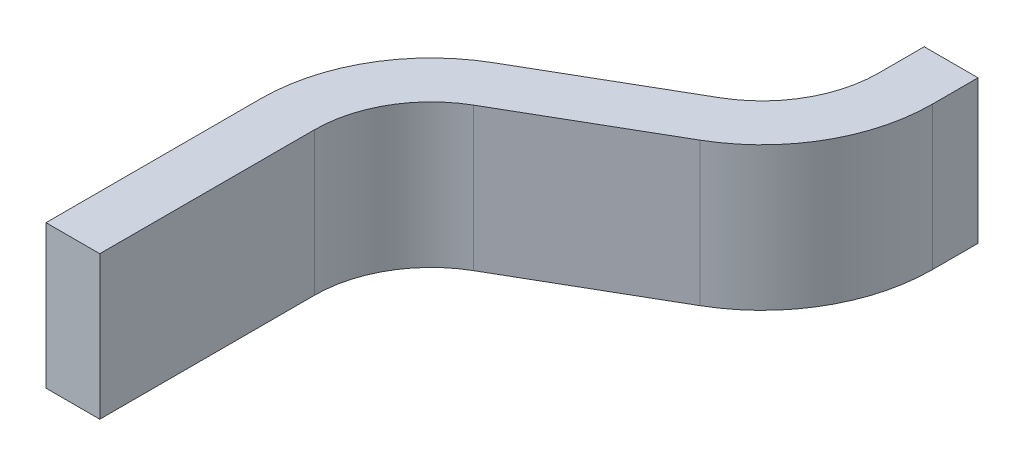
ISO-10303-21;
HEADER;
FILE_DESCRIPTION(('STEP AP214'),'2;1');
FILE_NAME('part.step','',(''),(''),'','','');
FILE_SCHEMA(('AUTOMOTIVE_DESIGN { 1 0 10303 214 1 1 1 1 }'));
ENDSEC;
DATA;
#1=APPLICATION_CONTEXT('core data for automotive mechanical design processes');
#2=APPLICATION_PROTOCOL_DEFINITION('international standard','automotive_design',2000,#1);
#3=PRODUCT_CONTEXT('',#1,'mechanical');
#4=PRODUCT('Part','Part','',(#3));
#5=PRODUCT_RELATED_PRODUCT_CATEGORY('part','',(#4));
#6=PRODUCT_DEFINITION_FORMATION('','',#4);
#7=PRODUCT_DEFINITION_CONTEXT('part definition',#1,'design');
#8=PRODUCT_DEFINITION('design','',#6,#7);
#9=PRODUCT_DEFINITION_SHAPE('','',#8);
#10=(LENGTH_UNIT() NAMED_UNIT(*) SI_UNIT(.MILLI.,.METRE.));
#11=(NAMED_UNIT(*) PLANE_ANGLE_UNIT() SI_UNIT($,.RADIAN.));
#12=(NAMED_UNIT(*) SI_UNIT($,.STERADIAN.) SOLID_ANGLE_UNIT());
#13=UNCERTAINTY_MEASURE_WITH_UNIT(LENGTH_MEASURE(1.E-05),#10,'distance_accuracy_value','');
#14=(GEOMETRIC_REPRESENTATION_CONTEXT(3) GLOBAL_UNCERTAINTY_ASSIGNED_CONTEXT((#13)) GLOBAL_UNIT_ASSIGNED_CONTEXT((#10,
#11,#12)) REPRESENTATION_CONTEXT('',''));
#15=CARTESIAN_POINT('',(0.,0.,0.));
#16=DIRECTION('',(0.,0.,1.));
#17=DIRECTION('',(1.,0.,0.));
#18=AXIS2_PLACEMENT_3D('',#15,#16,#17);
#19=CARTESIAN_POINT('',(30.57268,6.0955541535619,2.82633168836518));
#20=DIRECTION('',(1.,0.,0.));
#21=DIRECTION('',(0.,0.,-1.));
#22=AXIS2_PLACEMENT_3D('',#19,#20,#21);
#23=PLANE('',#22);
#24=DIRECTION('',(0.,1.,4.37113884532334E-08));
#25=VECTOR('',#24,1.);
#26=CARTESIAN_POINT('',(30.57268,6.2955541535619,2.82633169710745));
#27=LINE('',#26,#25);
#28=CARTESIAN_POINT('',(30.57268,6.0955541535625,2.82633168836404));
#29=VERTEX_POINT('',#28);
#30=CARTESIAN_POINT('',(30.57268,6.4955541531869,2.82633170584745));
#31=VERTEX_POINT('',#30);
#32=EDGE_CURVE('E27',#29,#31,#27,.T.);
#33=ORIENTED_EDGE('',*,*,#32,.F.);
#34=DIRECTION('',(0.,-4.37113884532334E-08,1.));
#35=VECTOR('',#34,1.);
#36=CARTESIAN_POINT('',(30.57268,6.0955541535619,2.82633168836518));
#37=LINE('',#36,#35);
#38=CARTESIAN_POINT('',(30.57268,6.09555415912137,2.69915201159442));
#39=VERTEX_POINT('',#38);
#40=EDGE_CURVE('E191',#39,#29,#37,.T.);
#41=ORIENTED_EDGE('',*,*,#40,.F.);
#42=DIRECTION('',(0.,-1.,-4.37113884532334E-08));
#43=VECTOR('',#42,1.);
#44=CARTESIAN_POINT('',(30.57268,6.2955541591219,2.69915202013518));
#45=LINE('',#44,#43);
#46=CARTESIAN_POINT('',(30.57268,6.49555415912137,2.6991520290826));
#47=VERTEX_POINT('',#46);
#48=EDGE_CURVE('E11',#47,#39,#45,.T.);
#49=ORIENTED_EDGE('',*,*,#48,.F.);
#50=DIRECTION('',(0.,4.37113884532334E-08,-1.));
#51=VECTOR('',#50,1.);
#52=CARTESIAN_POINT('',(30.57268,6.4955541535619,2.82633170584518));
#53=LINE('',#52,#51);
#54=EDGE_CURVE('E218',#31,#47,#53,.T.);
#55=ORIENTED_EDGE('',*,*,#54,.F.);
#56=EDGE_LOOP('',(#33,#41,#49,#55));
#57=FACE_BOUND('',#56,.T.);
#58=ADVANCED_FACE('F16',(#57),#23,.T.);
#59=CARTESIAN_POINT('',(30.49768,6.2955541591219,2.69915202013518));
#60=DIRECTION('',(0.,4.37113884532334E-08,-1.));
#61=DIRECTION('',(-1.,0.,0.));
#62=AXIS2_PLACEMENT_3D('',#59,#60,#61);
#63=PLANE('',#62);
#64=DIRECTION('',(1.,0.,0.));
#65=VECTOR('',#64,1.);
#66=CARTESIAN_POINT('',(30.57268,6.0955541591211,2.69915201169518));
#67=LINE('',#66,#65);
#68=CARTESIAN_POINT('',(30.42268,6.09555415912163,2.69915202335518));
#69=VERTEX_POINT('',#68);
#70=EDGE_CURVE('E239',#69,#39,#67,.T.);
#71=ORIENTED_EDGE('',*,*,#70,.F.);
#72=DIRECTION('',(0.,-1.,0.));
#73=VECTOR('',#72,1.);
#74=CARTESIAN_POINT('',(30.42268,6.0955541535619,2.69915202918518));
#75=LINE('',#74,#73);
#76=CARTESIAN_POINT('',(30.42268,6.49555415491497,2.69915202918518));
#77=VERTEX_POINT('',#76);
#78=EDGE_CURVE('E194',#77,#69,#75,.T.);
#79=ORIENTED_EDGE('',*,*,#78,.F.);
#80=DIRECTION('',(-1.,0.,0.));
#81=VECTOR('',#80,1.);
#82=CARTESIAN_POINT('',(30.57268,6.4955541591211,2.69915202918518));
#83=LINE('',#82,#81);
#84=EDGE_CURVE('E222',#47,#77,#83,.T.);
#85=ORIENTED_EDGE('',*,*,#84,.F.);
#86=ORIENTED_EDGE('',*,*,#48,.T.);
#87=EDGE_LOOP('',(#71,#79,#85,#86));
#88=FACE_BOUND('',#87,.T.);
#89=ADVANCED_FACE('F278',(#88),#63,.T.);
#90=CARTESIAN_POINT('',(30.09768,6.2955541535619,2.82633169710518));
#91=DIRECTION('',(0.,-1.,-4.3711388675316E-08));
#92=DIRECTION('',(0.,4.3711388675316E-08,-1.));
#93=AXIS2_PLACEMENT_3D('',#90,#91,#92);
#94=CYLINDRICAL_SURFACE('',#93,0.475);
#95=DIRECTION('',(-1.89275863434327E-08,-1.,-3.27835413815946E-08));
#96=VECTOR('',#95,1.);
#97=CARTESIAN_POINT('',(30.3351799924309,6.0955541355819,3.23769375953518));
#98=LINE('',#97,#96);
#99=CARTESIAN_POINT('',(30.3351800000026,6.4955541352063,3.23769377264595));
#100=VERTEX_POINT('',#99);
#101=CARTESIAN_POINT('',(30.3351799962154,6.0955541355819,3.23769375734786));
#102=VERTEX_POINT('',#101);
#103=EDGE_CURVE('E251',#100,#102,#98,.T.);
#104=ORIENTED_EDGE('',*,*,#103,.T.);
#105=CARTESIAN_POINT('',(30.09768,6.09555415356311,2.8263316883629));
#106=DIRECTION('',(0.,1.,4.3711388675316E-08));
#107=DIRECTION('',(0.,4.3711388675316E-08,-1.));
#108=AXIS2_PLACEMENT_3D('',#105,#106,#107);
#109=CIRCLE('',#108,0.475);
#110=EDGE_CURVE('E187',#102,#29,#109,.T.);
#111=ORIENTED_EDGE('',*,*,#110,.T.);
#112=ORIENTED_EDGE('',*,*,#32,.T.);
#113=CARTESIAN_POINT('',(30.09768,6.4955541528119,2.82633170584745));
#114=DIRECTION('',(0.,-1.,-4.3711388675316E-08));
#115=DIRECTION('',(0.,4.3711388675316E-08,-1.));
#116=AXIS2_PLACEMENT_3D('',#113,#114,#115);
#117=CIRCLE('',#116,0.475);
#118=EDGE_CURVE('E215',#31,#100,#117,.T.);
#119=ORIENTED_EDGE('',*,*,#118,.T.);
#120=EDGE_LOOP('',(#104,#111,#112,#119));
#121=FACE_BOUND('',#120,.T.);
#122=ADVANCED_FACE('F268',(#121),#94,.T.);
#123=CARTESIAN_POINT('',(30.42268,6.0955541535619,2.82633168836518));
#124=DIRECTION('',(-1.,0.,0.));
#125=DIRECTION('',(0.,1.,0.));
#126=AXIS2_PLACEMENT_3D('',#123,#124,#125);
#127=PLANE('',#126);
#128=DIRECTION('',(0.,1.,4.37113884532334E-08));
#129=VECTOR('',#128,1.);
#130=CARTESIAN_POINT('',(30.42268,6.2955541535619,2.82633169710745));
#131=LINE('',#130,#129);
#132=CARTESIAN_POINT('',(30.42268,6.0955541563419,2.82633168836518));
#133=VERTEX_POINT('',#132);
#134=CARTESIAN_POINT('',(30.42268,6.4955541531869,2.82633170584632));
#135=VERTEX_POINT('',#134);
#136=EDGE_CURVE('E176',#133,#135,#131,.T.);
#137=ORIENTED_EDGE('',*,*,#136,.T.);
#138=DIRECTION('',(0.,0.,-1.));
#139=VECTOR('',#138,1.);
#140=CARTESIAN_POINT('',(30.42268,6.4955541528119,2.82633168836518));
#141=LINE('',#140,#139);
#142=EDGE_CURVE('E219',#135,#77,#141,.T.);
#143=ORIENTED_EDGE('',*,*,#142,.T.);
#144=ORIENTED_EDGE('',*,*,#78,.T.);
#145=DIRECTION('',(0.,0.,1.));
#146=VECTOR('',#145,1.);
#147=CARTESIAN_POINT('',(30.42268,6.0955541591219,2.82633168836518));
#148=LINE('',#147,#146);
#149=EDGE_CURVE('E244',#69,#133,#148,.T.);
#150=ORIENTED_EDGE('',*,*,#149,.T.);
#151=EDGE_LOOP('',(#137,#143,#144,#150));
#152=FACE_BOUND('',#151,.T.);
#153=ADVANCED_FACE('F281',(#152),#127,.T.);
#154=CARTESIAN_POINT('',(30.33518,6.0955541355819,3.23769375516518));
#155=DIRECTION('',(-0.50000000000019,3.78551728341957E-08,-0.866025403784328));
#156=DIRECTION('',(-0.866025403784329,0.,0.50000000000019));
#157=AXIS2_PLACEMENT_3D('',#154,#155,#156);
#158=PLANE('',#157);
#159=DIRECTION('',(-0.866025403780548,-2.18556935242253E-08,0.500000000006738));
#160=VECTOR('',#159,1.);
#161=CARTESIAN_POINT('',(30.33518,6.4955541355819,3.23769377264518));
#162=LINE('',#161,#160);
#163=CARTESIAN_POINT('',(29.9351799999989,6.49555412566836,3.46863388032698));
#164=VERTEX_POINT('',#163);
#165=EDGE_CURVE('E20',#100,#164,#162,.T.);
#166=ORIENTED_EDGE('',*,*,#165,.T.);
#167=DIRECTION('',(0.,-1.,-4.37113884532334E-08));
#168=VECTOR('',#167,1.);
#169=CARTESIAN_POINT('',(29.935180000001,6.29555412548483,3.46863387158466));
#170=LINE('',#169,#168);
#171=CARTESIAN_POINT('',(29.9351800000005,6.09555412548322,3.46863386283878));
#172=VERTEX_POINT('',#171);
#173=EDGE_CURVE('E202',#164,#172,#170,.T.);
#174=ORIENTED_EDGE('',*,*,#173,.T.);
#175=DIRECTION('',(0.866025403789923,2.18556935244619E-08,-0.4999999999905));
#176=VECTOR('',#175,1.);
#177=CARTESIAN_POINT('',(29.93518,6.09555412548719,3.46863386283518));
#178=LINE('',#177,#176);
#179=EDGE_CURVE('E172',#172,#102,#178,.T.);
#180=ORIENTED_EDGE('',*,*,#179,.T.);
#181=ORIENTED_EDGE('',*,*,#103,.F.);
#182=EDGE_LOOP('',(#166,#174,#180,#181));
#183=FACE_BOUND('',#182,.T.);
#184=ADVANCED_FACE('F263',(#183),#158,.F.);
#185=CARTESIAN_POINT('',(30.09768,6.2955541535619,2.82633169710518));
#186=DIRECTION('',(0.,-1.,-4.3711388675316E-08));
#187=DIRECTION('',(0.,4.3711388675316E-08,-1.));
#188=AXIS2_PLACEMENT_3D('',#185,#186,#187);
#189=CYLINDRICAL_SURFACE('',#188,0.325);
#190=CARTESIAN_POINT('',(30.09768,6.09555415356483,2.8263316883629));
#191=DIRECTION('',(0.,1.,4.3711388675316E-08));
#192=DIRECTION('',(0.,4.3711388675316E-08,-1.));
#193=AXIS2_PLACEMENT_3D('',#190,#191,#192);
#194=CIRCLE('',#193,0.325);
#195=CARTESIAN_POINT('',(30.2601799999995,6.0955541365869,3.1077899445943));
#196=VERTEX_POINT('',#195);
#197=EDGE_CURVE('E241',#196,#133,#194,.T.);
#198=ORIENTED_EDGE('',*,*,#197,.F.);
#199=DIRECTION('',(1.89275863434327E-08,1.,3.27835413815946E-08));
#200=VECTOR('',#199,1.);
#201=CARTESIAN_POINT('',(30.26018,6.0955541412619,3.10778994459518));
#202=LINE('',#201,#200);
#203=CARTESIAN_POINT('',(30.260180003786,6.49555414107044,3.10778995989272));
#204=VERTEX_POINT('',#203);
#205=EDGE_CURVE('E42',#196,#204,#202,.T.);
#206=ORIENTED_EDGE('',*,*,#205,.T.);
#207=CARTESIAN_POINT('',(30.09768,6.4955541528119,2.82633170584745));
#208=DIRECTION('',(0.,-1.,-4.3711388675316E-08));
#209=DIRECTION('',(0.,4.3711388675316E-08,-1.));
#210=AXIS2_PLACEMENT_3D('',#207,#208,#209);
#211=CIRCLE('',#210,0.325);
#212=EDGE_CURVE('E212',#135,#204,#211,.T.);
#213=ORIENTED_EDGE('',*,*,#212,.F.);
#214=ORIENTED_EDGE('',*,*,#136,.F.);
#215=EDGE_LOOP('',(#198,#206,#213,#214));
#216=FACE_BOUND('',#215,.T.);
#217=ADVANCED_FACE('F287',(#216),#189,.F.);
#218=CARTESIAN_POINT('',(30.09768,6.2955541131819,3.75009212781518));
#219=DIRECTION('',(0.,1.,4.3711388675316E-08));
#220=DIRECTION('',(0.,-4.3711388675316E-08,1.));
#221=AXIS2_PLACEMENT_3D('',#218,#219,#220);
#222=CYLINDRICAL_SURFACE('',#221,0.325);
#223=CARTESIAN_POINT('',(30.09768,6.4955541135519,3.75009213655746));
#224=DIRECTION('',(0.,1.,4.3711388675316E-08));
#225=DIRECTION('',(0.,-4.3711388675316E-08,1.));
#226=AXIS2_PLACEMENT_3D('',#223,#224,#225);
#227=CIRCLE('',#226,0.325);
#228=CARTESIAN_POINT('',(29.77268,6.4955541133669,3.75009213655632));
#229=VERTEX_POINT('',#228);
#230=EDGE_CURVE('E149',#164,#229,#227,.T.);
#231=ORIENTED_EDGE('',*,*,#230,.T.);
#232=DIRECTION('',(0.,-1.,0.));
#233=VECTOR('',#232,1.);
#234=CARTESIAN_POINT('',(29.77268,6.0955541131819,3.75009213655518));
#235=LINE('',#234,#233);
#236=CARTESIAN_POINT('',(29.77268,6.09555411318043,3.75009212781018));
#237=VERTEX_POINT('',#236);
#238=EDGE_CURVE('E66',#229,#237,#235,.T.);
#239=ORIENTED_EDGE('',*,*,#238,.T.);
#240=CARTESIAN_POINT('',(30.09768,6.09555411317897,3.7500921190729));
#241=DIRECTION('',(0.,-1.,-4.3711388675316E-08));
#242=DIRECTION('',(0.,-4.3711388675316E-08,1.));
#243=AXIS2_PLACEMENT_3D('',#240,#241,#242);
#244=CIRCLE('',#243,0.325);
#245=EDGE_CURVE('E165',#237,#172,#244,.T.);
#246=ORIENTED_EDGE('',*,*,#245,.T.);
#247=ORIENTED_EDGE('',*,*,#173,.F.);
#248=EDGE_LOOP('',(#231,#239,#246,#247));
#249=FACE_BOUND('',#248,.T.);
#250=ADVANCED_FACE('F18',(#249),#222,.F.);
#251=CARTESIAN_POINT('',(29.77268,6.0955541131819,3.75009211906518));
#252=DIRECTION('',(-1.,0.,0.));
#253=DIRECTION('',(0.,1.,0.));
#254=AXIS2_PLACEMENT_3D('',#251,#252,#253);
#255=PLANE('',#254);
#256=DIRECTION('',(0.,-4.37113884532334E-08,1.));
#257=VECTOR('',#256,1.);
#258=CARTESIAN_POINT('',(29.77268,6.4955541131819,3.75009213655518));
#259=LINE('',#258,#257);
#260=CARTESIAN_POINT('',(29.77268,6.49555408724665,4.34915202887746));
#261=VERTEX_POINT('',#260);
#262=EDGE_CURVE('E143',#229,#261,#259,.T.);
#263=ORIENTED_EDGE('',*,*,#262,.T.);
#264=DIRECTION('',(0.,-1.,-4.37113884532334E-08));
#265=VECTOR('',#264,1.);
#266=CARTESIAN_POINT('',(29.77268,6.2955540869919,4.34915202013518));
#267=LINE('',#266,#265);
#268=CARTESIAN_POINT('',(29.77268,6.09555408699474,4.34915201172109));
#269=VERTEX_POINT('',#268);
#270=EDGE_CURVE('E81',#261,#269,#267,.T.);
#271=ORIENTED_EDGE('',*,*,#270,.T.);
#272=DIRECTION('',(0.,4.37113884532334E-08,-1.));
#273=VECTOR('',#272,1.);
#274=CARTESIAN_POINT('',(29.77268,6.0955541131819,3.75009211906518));
#275=LINE('',#274,#273);
#276=EDGE_CURVE('E208',#269,#237,#275,.T.);
#277=ORIENTED_EDGE('',*,*,#276,.T.);
#278=ORIENTED_EDGE('',*,*,#238,.F.);
#279=EDGE_LOOP('',(#263,#271,#277,#278));
#280=FACE_BOUND('',#279,.T.);
#281=ADVANCED_FACE('F145',(#280),#255,.F.);
#282=CARTESIAN_POINT('',(30.26018,6.0955541412619,3.10778994459518));
#283=DIRECTION('',(0.50000000000019,-3.78551728341957E-08,0.866025403784328));
#284=DIRECTION('',(-7.57103456683625E-08,-1.,0.));
#285=AXIS2_PLACEMENT_3D('',#282,#283,#284);
#286=PLANE('',#285);
#287=DIRECTION('',(0.866025403784329,0.,-0.50000000000019));
#288=VECTOR('',#287,1.);
#289=CARTESIAN_POINT('',(30.26018,6.0955541319119,3.10778994459518));
#290=LINE('',#289,#288);
#291=CARTESIAN_POINT('',(29.8601799962151,6.09555413153604,3.33873005445842));
#292=VERTEX_POINT('',#291);
#293=EDGE_CURVE('E207',#292,#196,#290,.T.);
#294=ORIENTED_EDGE('',*,*,#293,.F.);
#295=DIRECTION('',(0.,-1.,-4.37113884532334E-08));
#296=VECTOR('',#295,1.);
#297=CARTESIAN_POINT('',(29.860180000002,6.29555413116311,3.3387300610164));
#298=LINE('',#297,#296);
#299=CARTESIAN_POINT('',(29.8601800000011,6.49555413639604,3.33873006975712));
#300=VERTEX_POINT('',#299);
#301=EDGE_CURVE('E182',#300,#292,#298,.T.);
#302=ORIENTED_EDGE('',*,*,#301,.F.);
#303=DIRECTION('',(-0.866025403784329,0.,0.50000000000019));
#304=VECTOR('',#303,1.);
#305=CARTESIAN_POINT('',(30.2601800075711,6.4955541416319,3.1077899577086));
#306=LINE('',#305,#304);
#307=EDGE_CURVE('E209',#204,#300,#306,.T.);
#308=ORIENTED_EDGE('',*,*,#307,.F.);
#309=ORIENTED_EDGE('',*,*,#205,.F.);
#310=EDGE_LOOP('',(#294,#302,#308,#309));
#311=FACE_BOUND('',#310,.T.);
#312=ADVANCED_FACE('F310',(#311),#286,.F.);
#313=CARTESIAN_POINT('',(29.77268,6.4955541131819,3.75009213655518));
#314=DIRECTION('',(0.,-1.,-4.37113884532334E-08));
#315=DIRECTION('',(0.,4.37113884532334E-08,-1.));
#316=AXIS2_PLACEMENT_3D('',#313,#314,#315);
#317=PLANE('',#316);
#318=DIRECTION('',(0.,0.,1.));
#319=VECTOR('',#318,1.);
#320=CARTESIAN_POINT('',(29.62268,6.4955541135519,3.75009211906518));
#321=LINE('',#320,#319);
#322=CARTESIAN_POINT('',(29.62268,6.4955541134594,3.75009212781018));
#323=VERTEX_POINT('',#322);
#324=CARTESIAN_POINT('',(29.62268,6.49555409372903,4.34915202925075));
#325=VERTEX_POINT('',#324);
#326=EDGE_CURVE('E155',#323,#325,#321,.T.);
#327=ORIENTED_EDGE('',*,*,#326,.T.);
#328=DIRECTION('',(1.,0.,0.));
#329=VECTOR('',#328,1.);
#330=CARTESIAN_POINT('',(29.69768,6.4955540873719,4.34915202887746));
#331=LINE('',#330,#329);
#332=EDGE_CURVE('E150',#325,#261,#331,.T.);
#333=ORIENTED_EDGE('',*,*,#332,.T.);
#334=ORIENTED_EDGE('',*,*,#262,.F.);
#335=ORIENTED_EDGE('',*,*,#230,.F.);
#336=ORIENTED_EDGE('',*,*,#165,.F.);
#337=ORIENTED_EDGE('',*,*,#118,.F.);
#338=ORIENTED_EDGE('',*,*,#54,.T.);
#339=ORIENTED_EDGE('',*,*,#84,.T.);
#340=ORIENTED_EDGE('',*,*,#142,.F.);
#341=ORIENTED_EDGE('',*,*,#212,.T.);
#342=ORIENTED_EDGE('',*,*,#307,.T.);
#343=CARTESIAN_POINT('',(30.09768,6.4955541133669,3.75009213655746));
#344=DIRECTION('',(0.,-1.,-4.3711388675316E-08));
#345=DIRECTION('',(0.,-4.3711388675316E-08,1.));
#346=AXIS2_PLACEMENT_3D('',#343,#344,#345);
#347=CIRCLE('',#346,0.475);
#348=EDGE_CURVE('E178',#323,#300,#347,.T.);
#349=ORIENTED_EDGE('',*,*,#348,.F.);
#350=EDGE_LOOP('',(#327,#333,#334,#335,#336,#337,#338,#339,#340,#341,#342,#349));
#351=FACE_BOUND('',#350,.T.);
#352=ADVANCED_FACE('F153',(#351),#317,.F.);
#353=CARTESIAN_POINT('',(29.69768,6.2955540869919,4.34915202013518));
#354=DIRECTION('',(0.,4.37113884532334E-08,-1.));
#355=DIRECTION('',(-1.,0.,0.));
#356=AXIS2_PLACEMENT_3D('',#353,#354,#355);
#357=PLANE('',#356);
#358=DIRECTION('',(0.,-1.,0.));
#359=VECTOR('',#358,1.);
#360=CARTESIAN_POINT('',(29.62268,6.0955541131819,4.34915202937518));
#361=LINE('',#360,#359);
#362=CARTESIAN_POINT('',(29.62268,6.09555408699403,4.34915201394836));
#363=VERTEX_POINT('',#362);
#364=EDGE_CURVE('E186',#325,#363,#361,.T.);
#365=ORIENTED_EDGE('',*,*,#364,.T.);
#366=DIRECTION('',(1.,0.,0.));
#367=VECTOR('',#366,1.);
#368=CARTESIAN_POINT('',(29.77268,6.09555408699616,4.34915201188518));
#369=LINE('',#368,#367);
#370=EDGE_CURVE('E162',#363,#269,#369,.T.);
#371=ORIENTED_EDGE('',*,*,#370,.T.);
#372=ORIENTED_EDGE('',*,*,#270,.F.);
#373=ORIENTED_EDGE('',*,*,#332,.F.);
#374=EDGE_LOOP('',(#365,#371,#372,#373));
#375=FACE_BOUND('',#374,.T.);
#376=ADVANCED_FACE('F161',(#375),#357,.F.);
#377=CARTESIAN_POINT('',(29.77268,6.0955541131819,3.75009211906518));
#378=DIRECTION('',(0.,1.,4.37113884532334E-08));
#379=DIRECTION('',(1.,0.,-8.22026038403674E-09));
#380=AXIS2_PLACEMENT_3D('',#377,#378,#379);
#381=PLANE('',#380);
#382=ORIENTED_EDGE('',*,*,#276,.F.);
#383=ORIENTED_EDGE('',*,*,#370,.F.);
#384=DIRECTION('',(0.,0.,-1.));
#385=VECTOR('',#384,1.);
#386=CARTESIAN_POINT('',(29.62268,6.0955540869919,3.75009211906518));
#387=LINE('',#386,#385);
#388=CARTESIAN_POINT('',(29.62268,6.0955541004613,3.75009211906904));
#389=VERTEX_POINT('',#388);
#390=EDGE_CURVE('E248',#363,#389,#387,.T.);
#391=ORIENTED_EDGE('',*,*,#390,.T.);
#392=CARTESIAN_POINT('',(30.09768,6.09555411393069,3.7500921190729));
#393=DIRECTION('',(0.,1.,4.3711388675316E-08));
#394=DIRECTION('',(0.,-4.3711388675316E-08,1.));
#395=AXIS2_PLACEMENT_3D('',#392,#393,#394);
#396=CIRCLE('',#395,0.475);
#397=EDGE_CURVE('E197',#292,#389,#396,.T.);
#398=ORIENTED_EDGE('',*,*,#397,.F.);
#399=ORIENTED_EDGE('',*,*,#293,.T.);
#400=ORIENTED_EDGE('',*,*,#197,.T.);
#401=ORIENTED_EDGE('',*,*,#149,.F.);
#402=ORIENTED_EDGE('',*,*,#70,.T.);
#403=ORIENTED_EDGE('',*,*,#40,.T.);
#404=ORIENTED_EDGE('',*,*,#110,.F.);
#405=ORIENTED_EDGE('',*,*,#179,.F.);
#406=ORIENTED_EDGE('',*,*,#245,.F.);
#407=EDGE_LOOP('',(#382,#383,#391,#398,#399,#400,#401,#402,#403,#404,#405,#406));
#408=FACE_BOUND('',#407,.T.);
#409=ADVANCED_FACE('F285',(#408),#381,.F.);
#410=CARTESIAN_POINT('',(30.09768,6.2955541131819,3.75009212781518));
#411=DIRECTION('',(0.,1.,4.3711388675316E-08));
#412=DIRECTION('',(0.,-4.3711388675316E-08,1.));
#413=AXIS2_PLACEMENT_3D('',#410,#411,#412);
#414=CYLINDRICAL_SURFACE('',#413,0.475);
#415=DIRECTION('',(0.,1.,0.));
#416=VECTOR('',#415,1.);
#417=CARTESIAN_POINT('',(29.62268,6.0955541131819,3.75009211906518));
#418=LINE('',#417,#416);
#419=EDGE_CURVE('E183',#389,#323,#418,.T.);
#420=ORIENTED_EDGE('',*,*,#419,.T.);
#421=ORIENTED_EDGE('',*,*,#348,.T.);
#422=ORIENTED_EDGE('',*,*,#301,.T.);
#423=ORIENTED_EDGE('',*,*,#397,.T.);
#424=EDGE_LOOP('',(#420,#421,#422,#423));
#425=FACE_BOUND('',#424,.T.);
#426=ADVANCED_FACE('F307',(#425),#414,.T.);
#427=CARTESIAN_POINT('',(29.62268,6.0955541131819,3.75009211906518));
#428=DIRECTION('',(1.,0.,0.));
#429=DIRECTION('',(0.,0.,-1.));
#430=AXIS2_PLACEMENT_3D('',#427,#428,#429);
#431=PLANE('',#430);
#432=ORIENTED_EDGE('',*,*,#390,.F.);
#433=ORIENTED_EDGE('',*,*,#364,.F.);
#434=ORIENTED_EDGE('',*,*,#326,.F.);
#435=ORIENTED_EDGE('',*,*,#419,.F.);
#436=EDGE_LOOP('',(#432,#433,#434,#435));
#437=FACE_BOUND('',#436,.T.);
#438=ADVANCED_FACE('F305',(#437),#431,.F.);
#439=CLOSED_SHELL('',(#58,#89,#122,#153,#184,#217,#250,#281,#312,#352,#376,#409,#426,#438));
#440=MANIFOLD_SOLID_BREP('B1',#439);
#441=ADVANCED_BREP_SHAPE_REPRESENTATION('',(#18,#440),#14);
#442=SHAPE_DEFINITION_REPRESENTATION(#9,#441);
ENDSEC;
END-ISO-10303-21;
